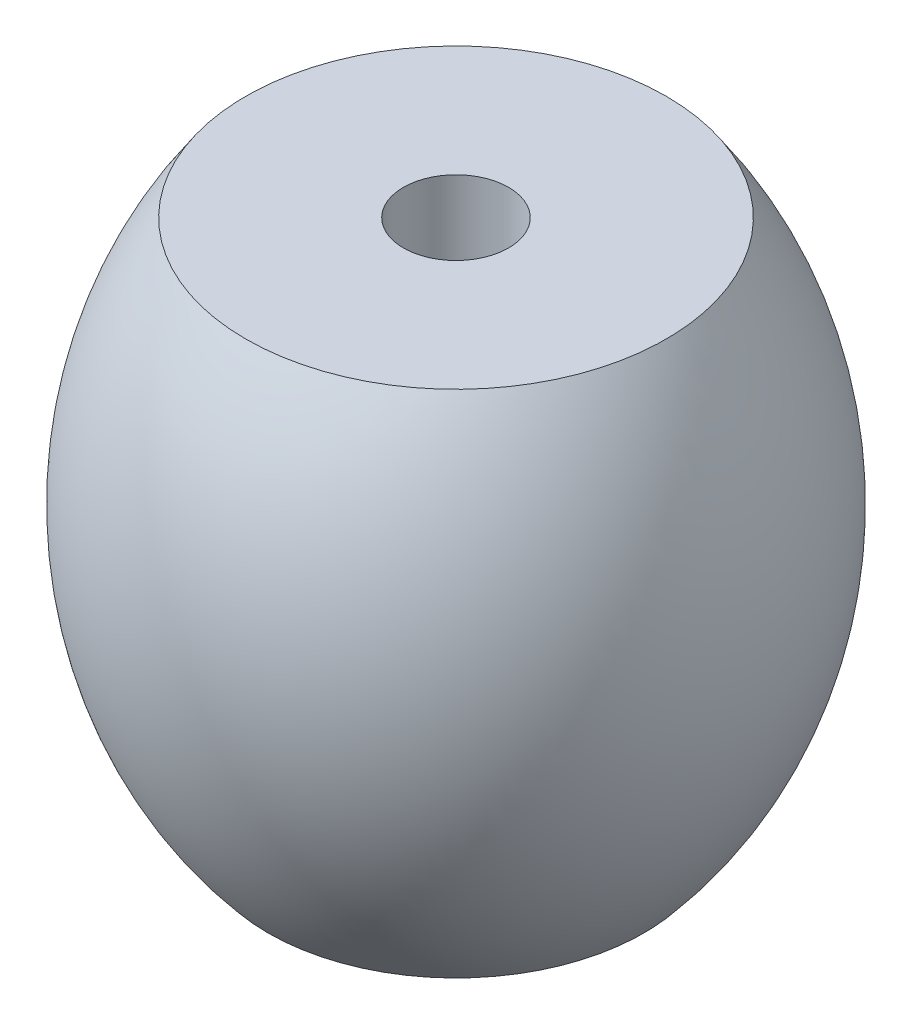
ISO-10303-21;
HEADER;
FILE_DESCRIPTION(('STEP AP214'),'2;1');
FILE_NAME('part.step','',(''),(''),'','','');
FILE_SCHEMA(('AUTOMOTIVE_DESIGN { 1 0 10303 214 1 1 1 1 }'));
ENDSEC;
DATA;
#1=APPLICATION_CONTEXT('core data for automotive mechanical design processes');
#2=APPLICATION_PROTOCOL_DEFINITION('international standard','automotive_design',2000,#1);
#3=PRODUCT_CONTEXT('',#1,'mechanical');
#4=PRODUCT('Part','Part','',(#3));
#5=PRODUCT_RELATED_PRODUCT_CATEGORY('part','',(#4));
#6=PRODUCT_DEFINITION_FORMATION('','',#4);
#7=PRODUCT_DEFINITION_CONTEXT('part definition',#1,'design');
#8=PRODUCT_DEFINITION('design','',#6,#7);
#9=PRODUCT_DEFINITION_SHAPE('','',#8);
#10=(LENGTH_UNIT() NAMED_UNIT(*) SI_UNIT(.MILLI.,.METRE.));
#11=(NAMED_UNIT(*) PLANE_ANGLE_UNIT() SI_UNIT($,.RADIAN.));
#12=(NAMED_UNIT(*) SI_UNIT($,.STERADIAN.) SOLID_ANGLE_UNIT());
#13=UNCERTAINTY_MEASURE_WITH_UNIT(LENGTH_MEASURE(1.E-05),#10,'distance_accuracy_value','');
#14=(GEOMETRIC_REPRESENTATION_CONTEXT(3) GLOBAL_UNCERTAINTY_ASSIGNED_CONTEXT((#13)) GLOBAL_UNIT_ASSIGNED_CONTEXT((#10,
#11,#12)) REPRESENTATION_CONTEXT('',''));
#15=CARTESIAN_POINT('',(0.,0.,0.));
#16=DIRECTION('',(0.,0.,1.));
#17=DIRECTION('',(1.,0.,0.));
#18=AXIS2_PLACEMENT_3D('',#15,#16,#17);
#19=CARTESIAN_POINT('',(0.,0.,0.));
#20=DIRECTION('',(0.,-1.,0.));
#21=DIRECTION('',(0.,0.,-1.));
#22=AXIS2_PLACEMENT_3D('',#19,#20,#21);
#23=CYLINDRICAL_SURFACE('',#22,1.);
#24=CARTESIAN_POINT('',(0.,10.,0.));
#25=DIRECTION('',(0.,-1.,0.));
#26=DIRECTION('',(0.,0.,-1.));
#27=AXIS2_PLACEMENT_3D('',#24,#25,#26);
#28=CIRCLE('',#27,1.);
#29=CARTESIAN_POINT('',(0.,10.,-1.));
#30=VERTEX_POINT('',#29);
#31=EDGE_CURVE('E10',#30,#30,#28,.T.);
#32=ORIENTED_EDGE('',*,*,#31,.F.);
#33=EDGE_LOOP('',(#32));
#34=FACE_BOUND('',#33,.T.);
#35=CARTESIAN_POINT('',(0.,7.,0.));
#36=DIRECTION('',(0.,-1.,0.));
#37=DIRECTION('',(0.,0.,-1.));
#38=AXIS2_PLACEMENT_3D('',#35,#36,#37);
#39=CIRCLE('',#38,0.999999999999999);
#40=CARTESIAN_POINT('',(0.,7.,-0.999999999999999));
#41=VERTEX_POINT('',#40);
#42=EDGE_CURVE('E72',#41,#41,#39,.T.);
#43=ORIENTED_EDGE('',*,*,#42,.T.);
#44=EDGE_LOOP('',(#43));
#45=FACE_BOUND('',#44,.T.);
#46=ADVANCED_FACE('F37',(#34,#45),#23,.F.);
#47=CARTESIAN_POINT('',(-1.,10.,0.));
#48=DIRECTION('',(0.,-1.,0.));
#49=DIRECTION('',(0.,0.,-1.));
#50=AXIS2_PLACEMENT_3D('',#47,#48,#49);
#51=PLANE('',#50);
#52=CARTESIAN_POINT('',(0.,10.,0.));
#53=DIRECTION('',(0.,-1.,0.));
#54=DIRECTION('',(0.,0.,-1.));
#55=AXIS2_PLACEMENT_3D('',#52,#53,#54);
#56=CIRCLE('',#55,4.);
#57=CARTESIAN_POINT('',(0.,10.,-4.));
#58=VERTEX_POINT('',#57);
#59=EDGE_CURVE('E44',#58,#58,#56,.T.);
#60=ORIENTED_EDGE('',*,*,#59,.F.);
#61=EDGE_LOOP('',(#60));
#62=FACE_BOUND('',#61,.T.);
#63=ORIENTED_EDGE('',*,*,#31,.T.);
#64=EDGE_LOOP('',(#63));
#65=FACE_BOUND('',#64,.T.);
#66=ADVANCED_FACE('F110',(#62,#65),#51,.F.);
#67=CARTESIAN_POINT('',(0.,5.27405628221283,0.));
#68=DIRECTION('',(0.,-1.,0.));
#69=DIRECTION('',(0.,0.,-1.));
#70=AXIS2_PLACEMENT_3D('',#67,#68,#69);
#71=DEGENERATE_TOROIDAL_SURFACE('',#70,2.65473056240979,8.16210652233619,.F.);
#72=CARTESIAN_POINT('',(0.,0.,0.));
#73=DIRECTION('',(0.,-1.,0.));
#74=DIRECTION('',(0.,0.,-1.));
#75=AXIS2_PLACEMENT_3D('',#72,#73,#74);
#76=CIRCLE('',#75,3.57458025131707);
#77=CARTESIAN_POINT('',(0.,0.,-3.57458025131707));
#78=VERTEX_POINT('',#77);
#79=EDGE_CURVE('E49',#78,#78,#76,.T.);
#80=ORIENTED_EDGE('',*,*,#79,.F.);
#81=EDGE_LOOP('',(#80));
#82=FACE_BOUND('',#81,.T.);
#83=ORIENTED_EDGE('',*,*,#59,.T.);
#84=EDGE_LOOP('',(#83));
#85=FACE_BOUND('',#84,.T.);
#86=ADVANCED_FACE('F105',(#82,#85),#71,.F.);
#87=CARTESIAN_POINT('',(-3.57458025131707,0.,0.));
#88=DIRECTION('',(0.,1.,0.));
#89=DIRECTION('',(0.,0.,1.));
#90=AXIS2_PLACEMENT_3D('',#87,#88,#89);
#91=PLANE('',#90);
#92=CARTESIAN_POINT('',(0.,0.,0.));
#93=DIRECTION('',(0.,-1.,0.));
#94=DIRECTION('',(0.,0.,-1.));
#95=AXIS2_PLACEMENT_3D('',#92,#93,#94);
#96=CIRCLE('',#95,2.);
#97=CARTESIAN_POINT('',(0.,0.,-2.));
#98=VERTEX_POINT('',#97);
#99=EDGE_CURVE('E54',#98,#98,#96,.T.);
#100=ORIENTED_EDGE('',*,*,#99,.F.);
#101=EDGE_LOOP('',(#100));
#102=FACE_BOUND('',#101,.T.);
#103=ORIENTED_EDGE('',*,*,#79,.T.);
#104=EDGE_LOOP('',(#103));
#105=FACE_BOUND('',#104,.T.);
#106=ADVANCED_FACE('F99',(#102,#105),#91,.F.);
#107=CARTESIAN_POINT('',(0.,0.,0.));
#108=DIRECTION('',(0.,-1.,0.));
#109=DIRECTION('',(0.,0.,-1.));
#110=AXIS2_PLACEMENT_3D('',#107,#108,#109);
#111=CYLINDRICAL_SURFACE('',#110,2.);
#112=CARTESIAN_POINT('',(0.,2.,0.));
#113=DIRECTION('',(0.,-1.,0.));
#114=DIRECTION('',(0.,0.,-1.));
#115=AXIS2_PLACEMENT_3D('',#112,#113,#114);
#116=CIRCLE('',#115,2.);
#117=CARTESIAN_POINT('',(0.,2.,-2.));
#118=VERTEX_POINT('',#117);
#119=EDGE_CURVE('E60',#118,#118,#116,.T.);
#120=ORIENTED_EDGE('',*,*,#119,.F.);
#121=EDGE_LOOP('',(#120));
#122=FACE_BOUND('',#121,.T.);
#123=ORIENTED_EDGE('',*,*,#99,.T.);
#124=EDGE_LOOP('',(#123));
#125=FACE_BOUND('',#124,.T.);
#126=ADVANCED_FACE('F93',(#122,#125),#111,.F.);
#127=CARTESIAN_POINT('',(-2.,2.,0.));
#128=DIRECTION('',(0.,-1.,0.));
#129=DIRECTION('',(0.,0.,-1.));
#130=AXIS2_PLACEMENT_3D('',#127,#128,#129);
#131=PLANE('',#130);
#132=CARTESIAN_POINT('',(0.,2.,0.));
#133=DIRECTION('',(0.,-1.,0.));
#134=DIRECTION('',(0.,0.,-1.));
#135=AXIS2_PLACEMENT_3D('',#132,#133,#134);
#136=CIRCLE('',#135,3.71522432739856);
#137=CARTESIAN_POINT('',(0.,2.,-3.71522432739856));
#138=VERTEX_POINT('',#137);
#139=EDGE_CURVE('E64',#138,#138,#136,.T.);
#140=ORIENTED_EDGE('',*,*,#139,.F.);
#141=EDGE_LOOP('',(#140));
#142=FACE_BOUND('',#141,.T.);
#143=ORIENTED_EDGE('',*,*,#119,.T.);
#144=EDGE_LOOP('',(#143));
#145=FACE_BOUND('',#144,.T.);
#146=ADVANCED_FACE('F87',(#142,#145),#131,.F.);
#147=CARTESIAN_POINT('',(0.,5.27405628221283,0.));
#148=DIRECTION('',(0.,-1.,0.));
#149=DIRECTION('',(0.,0.,-1.));
#150=AXIS2_PLACEMENT_3D('',#147,#148,#149);
#151=DEGENERATE_TOROIDAL_SURFACE('',#150,2.65473056240979,7.16210652233619,.F.);
#152=CARTESIAN_POINT('',(0.,7.,0.));
#153=DIRECTION('',(0.,-1.,0.));
#154=DIRECTION('',(0.,0.,-1.));
#155=AXIS2_PLACEMENT_3D('',#152,#153,#154);
#156=CIRCLE('',#155,4.29630447708768);
#157=CARTESIAN_POINT('',(0.,7.,-4.29630447708768));
#158=VERTEX_POINT('',#157);
#159=EDGE_CURVE('E68',#158,#158,#156,.T.);
#160=ORIENTED_EDGE('',*,*,#159,.F.);
#161=EDGE_LOOP('',(#160));
#162=FACE_BOUND('',#161,.T.);
#163=ORIENTED_EDGE('',*,*,#139,.T.);
#164=EDGE_LOOP('',(#163));
#165=FACE_BOUND('',#164,.T.);
#166=ADVANCED_FACE('F81',(#162,#165),#151,.T.);
#167=CARTESIAN_POINT('',(-0.999999999999999,7.,0.));
#168=DIRECTION('',(0.,1.,0.));
#169=DIRECTION('',(0.,0.,1.));
#170=AXIS2_PLACEMENT_3D('',#167,#168,#169);
#171=PLANE('',#170);
#172=ORIENTED_EDGE('',*,*,#42,.F.);
#173=EDGE_LOOP('',(#172));
#174=FACE_BOUND('',#173,.T.);
#175=ORIENTED_EDGE('',*,*,#159,.T.);
#176=EDGE_LOOP('',(#175));
#177=FACE_BOUND('',#176,.T.);
#178=ADVANCED_FACE('F78',(#174,#177),#171,.F.);
#179=CLOSED_SHELL('',(#46,#66,#86,#106,#126,#146,#166,#178));
#180=MANIFOLD_SOLID_BREP('B2',#179);
#181=ADVANCED_BREP_SHAPE_REPRESENTATION('',(#18,#180),#14);
#182=SHAPE_DEFINITION_REPRESENTATION(#9,#181);
ENDSEC;
END-ISO-10303-21;
